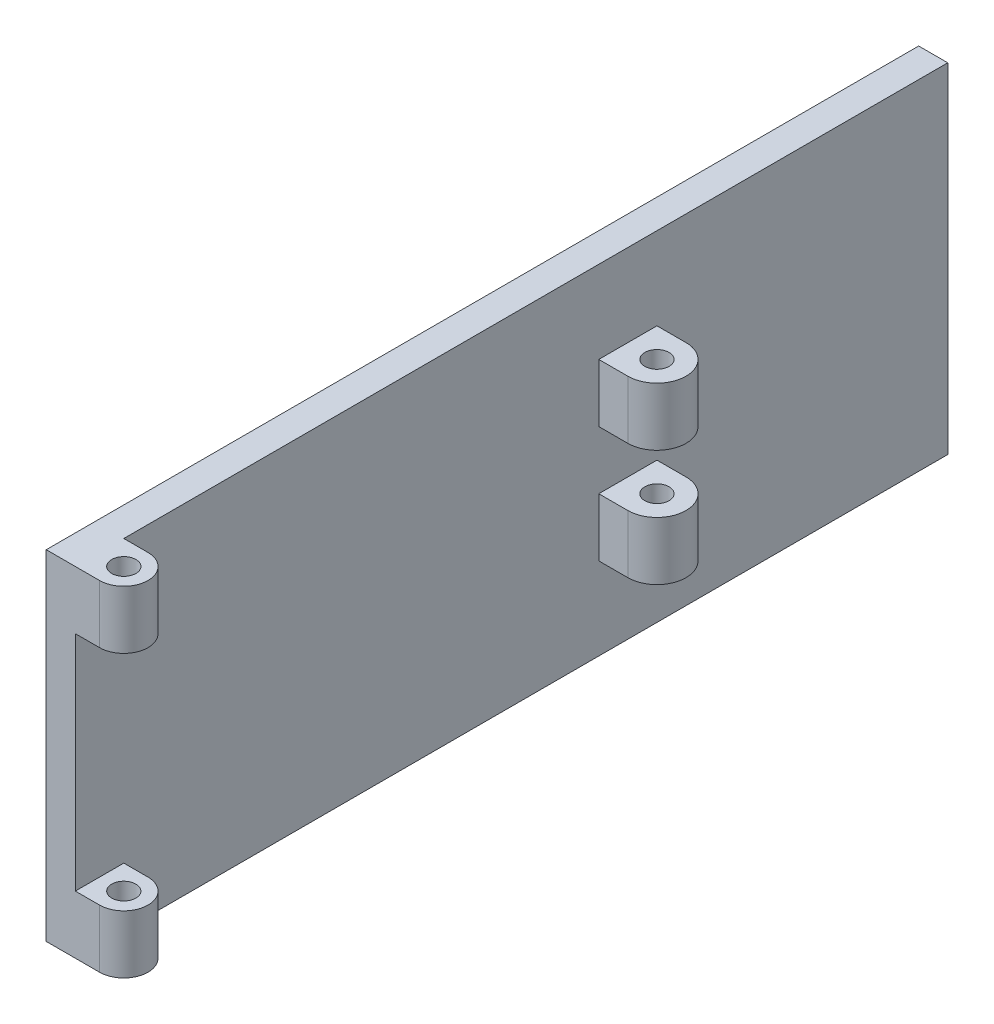
ISO-10303-21;
HEADER;
FILE_DESCRIPTION(('STEP AP214'),'2;1');
FILE_NAME('part.step','',(''),(''),'','','');
FILE_SCHEMA(('AUTOMOTIVE_DESIGN { 1 0 10303 214 1 1 1 1 }'));
ENDSEC;
DATA;
#1=APPLICATION_CONTEXT('core data for automotive mechanical design processes');
#2=APPLICATION_PROTOCOL_DEFINITION('international standard','automotive_design',2000,#1);
#3=PRODUCT_CONTEXT('',#1,'mechanical');
#4=PRODUCT('Part','Part','',(#3));
#5=PRODUCT_RELATED_PRODUCT_CATEGORY('part','',(#4));
#6=PRODUCT_DEFINITION_FORMATION('','',#4);
#7=PRODUCT_DEFINITION_CONTEXT('part definition',#1,'design');
#8=PRODUCT_DEFINITION('design','',#6,#7);
#9=PRODUCT_DEFINITION_SHAPE('','',#8);
#10=(LENGTH_UNIT() NAMED_UNIT(*) SI_UNIT(.MILLI.,.METRE.));
#11=(NAMED_UNIT(*) PLANE_ANGLE_UNIT() SI_UNIT($,.RADIAN.));
#12=(NAMED_UNIT(*) SI_UNIT($,.STERADIAN.) SOLID_ANGLE_UNIT());
#13=UNCERTAINTY_MEASURE_WITH_UNIT(LENGTH_MEASURE(1.E-05),#10,'distance_accuracy_value','');
#14=(GEOMETRIC_REPRESENTATION_CONTEXT(3) GLOBAL_UNCERTAINTY_ASSIGNED_CONTEXT((#13)) GLOBAL_UNIT_ASSIGNED_CONTEXT((#10,
#11,#12)) REPRESENTATION_CONTEXT('',''));
#15=CARTESIAN_POINT('',(0.,0.,0.));
#16=DIRECTION('',(0.,0.,1.));
#17=DIRECTION('',(1.,0.,0.));
#18=AXIS2_PLACEMENT_3D('',#15,#16,#17);
#19=CARTESIAN_POINT('',(9.,20.5,-54.));
#20=DIRECTION('',(0.,1.,0.));
#21=DIRECTION('',(0.,0.,1.));
#22=AXIS2_PLACEMENT_3D('',#19,#20,#21);
#23=PLANE('',#22);
#24=CARTESIAN_POINT('',(6.,20.5,-57.));
#25=DIRECTION('',(0.,1.,0.));
#26=DIRECTION('',(0.,0.,1.));
#27=AXIS2_PLACEMENT_3D('',#24,#25,#26);
#28=CIRCLE('',#27,1.25);
#29=CARTESIAN_POINT('',(6.,20.5,-55.75));
#30=VERTEX_POINT('',#29);
#31=EDGE_CURVE('E487',#30,#30,#28,.T.);
#32=ORIENTED_EDGE('',*,*,#31,.T.);
#33=EDGE_LOOP('',(#32));
#34=FACE_BOUND('',#33,.T.);
#35=CARTESIAN_POINT('',(6.,20.5,-57.));
#36=DIRECTION('',(0.,1.,0.));
#37=DIRECTION('',(0.,0.,1.));
#38=AXIS2_PLACEMENT_3D('',#35,#36,#37);
#39=CIRCLE('',#38,3.);
#40=CARTESIAN_POINT('',(6.,20.5,-54.));
#41=VERTEX_POINT('',#40);
#42=CARTESIAN_POINT('',(6.,20.5,-60.));
#43=VERTEX_POINT('',#42);
#44=EDGE_CURVE('E246',#41,#43,#39,.T.);
#45=ORIENTED_EDGE('',*,*,#44,.F.);
#46=DIRECTION('',(-1.,0.,0.));
#47=VECTOR('',#46,1.);
#48=CARTESIAN_POINT('',(9.,20.5,-54.));
#49=LINE('',#48,#47);
#50=CARTESIAN_POINT('',(3.,20.5,-54.));
#51=VERTEX_POINT('',#50);
#52=EDGE_CURVE('E254',#41,#51,#49,.T.);
#53=ORIENTED_EDGE('',*,*,#52,.T.);
#54=DIRECTION('',(0.,0.,-1.));
#55=VECTOR('',#54,1.);
#56=CARTESIAN_POINT('',(3.,20.5,-54.));
#57=LINE('',#56,#55);
#58=CARTESIAN_POINT('',(3.,20.5,-60.));
#59=VERTEX_POINT('',#58);
#60=EDGE_CURVE('E471',#51,#59,#57,.T.);
#61=ORIENTED_EDGE('',*,*,#60,.T.);
#62=DIRECTION('',(-1.,0.,0.));
#63=VECTOR('',#62,1.);
#64=CARTESIAN_POINT('',(9.,20.5,-60.));
#65=LINE('',#64,#63);
#66=EDGE_CURVE('E264',#43,#59,#65,.T.);
#67=ORIENTED_EDGE('',*,*,#66,.F.);
#68=EDGE_LOOP('',(#45,#53,#61,#67));
#69=FACE_BOUND('',#68,.T.);
#70=ADVANCED_FACE('F107',(#34,#69),#23,.F.);
#71=CARTESIAN_POINT('',(9.,26.5,-54.));
#72=DIRECTION('',(0.,-1.,0.));
#73=DIRECTION('',(0.,0.,-1.));
#74=AXIS2_PLACEMENT_3D('',#71,#72,#73);
#75=PLANE('',#74);
#76=CARTESIAN_POINT('',(6.,26.5,-57.));
#77=DIRECTION('',(0.,-1.,0.));
#78=DIRECTION('',(0.,0.,-1.));
#79=AXIS2_PLACEMENT_3D('',#76,#77,#78);
#80=CIRCLE('',#79,1.25);
#81=CARTESIAN_POINT('',(6.,26.5,-58.25));
#82=VERTEX_POINT('',#81);
#83=EDGE_CURVE('E484',#82,#82,#80,.T.);
#84=ORIENTED_EDGE('',*,*,#83,.T.);
#85=EDGE_LOOP('',(#84));
#86=FACE_BOUND('',#85,.T.);
#87=DIRECTION('',(-1.,0.,0.));
#88=VECTOR('',#87,1.);
#89=CARTESIAN_POINT('',(9.,26.5,-54.));
#90=LINE('',#89,#88);
#91=CARTESIAN_POINT('',(6.,26.5,-54.));
#92=VERTEX_POINT('',#91);
#93=CARTESIAN_POINT('',(3.,26.5,-54.));
#94=VERTEX_POINT('',#93);
#95=EDGE_CURVE('E252',#92,#94,#90,.T.);
#96=ORIENTED_EDGE('',*,*,#95,.F.);
#97=CARTESIAN_POINT('',(6.,26.5,-57.));
#98=DIRECTION('',(0.,-1.,0.));
#99=DIRECTION('',(0.,0.,-1.));
#100=AXIS2_PLACEMENT_3D('',#97,#98,#99);
#101=CIRCLE('',#100,3.);
#102=CARTESIAN_POINT('',(6.,26.5,-60.));
#103=VERTEX_POINT('',#102);
#104=EDGE_CURVE('E236',#103,#92,#101,.T.);
#105=ORIENTED_EDGE('',*,*,#104,.F.);
#106=DIRECTION('',(-1.,0.,0.));
#107=VECTOR('',#106,1.);
#108=CARTESIAN_POINT('',(9.,26.5,-60.));
#109=LINE('',#108,#107);
#110=CARTESIAN_POINT('',(3.,26.5,-60.));
#111=VERTEX_POINT('',#110);
#112=EDGE_CURVE('E262',#103,#111,#109,.T.);
#113=ORIENTED_EDGE('',*,*,#112,.T.);
#114=DIRECTION('',(0.,0.,1.));
#115=VECTOR('',#114,1.);
#116=CARTESIAN_POINT('',(3.,26.5,-54.));
#117=LINE('',#116,#115);
#118=EDGE_CURVE('E261',#111,#94,#117,.T.);
#119=ORIENTED_EDGE('',*,*,#118,.T.);
#120=EDGE_LOOP('',(#96,#105,#113,#119));
#121=FACE_BOUND('',#120,.T.);
#122=ADVANCED_FACE('F259',(#86,#121),#75,.F.);
#123=CARTESIAN_POINT('',(9.,8.49999999999999,-54.));
#124=DIRECTION('',(0.,1.,0.));
#125=DIRECTION('',(0.,0.,1.));
#126=AXIS2_PLACEMENT_3D('',#123,#124,#125);
#127=PLANE('',#126);
#128=CARTESIAN_POINT('',(6.,8.49999999999999,-57.));
#129=DIRECTION('',(0.,1.,0.));
#130=DIRECTION('',(0.,0.,1.));
#131=AXIS2_PLACEMENT_3D('',#128,#129,#130);
#132=CIRCLE('',#131,1.25);
#133=CARTESIAN_POINT('',(6.,8.49999999999999,-55.75));
#134=VERTEX_POINT('',#133);
#135=EDGE_CURVE('E479',#134,#134,#132,.T.);
#136=ORIENTED_EDGE('',*,*,#135,.T.);
#137=EDGE_LOOP('',(#136));
#138=FACE_BOUND('',#137,.T.);
#139=CARTESIAN_POINT('',(6.,8.49999999999999,-57.));
#140=DIRECTION('',(0.,1.,0.));
#141=DIRECTION('',(0.,0.,1.));
#142=AXIS2_PLACEMENT_3D('',#139,#140,#141);
#143=CIRCLE('',#142,3.);
#144=CARTESIAN_POINT('',(6.,8.49999999999999,-54.));
#145=VERTEX_POINT('',#144);
#146=CARTESIAN_POINT('',(6.,8.49999999999999,-60.));
#147=VERTEX_POINT('',#146);
#148=EDGE_CURVE('E247',#145,#147,#143,.T.);
#149=ORIENTED_EDGE('',*,*,#148,.F.);
#150=DIRECTION('',(-1.,0.,0.));
#151=VECTOR('',#150,1.);
#152=CARTESIAN_POINT('',(9.,8.49999999999999,-54.));
#153=LINE('',#152,#151);
#154=CARTESIAN_POINT('',(3.,8.49999999999999,-54.));
#155=VERTEX_POINT('',#154);
#156=EDGE_CURVE('E124',#145,#155,#153,.T.);
#157=ORIENTED_EDGE('',*,*,#156,.T.);
#158=DIRECTION('',(0.,0.,-1.));
#159=VECTOR('',#158,1.);
#160=CARTESIAN_POINT('',(3.,8.49999999999999,-54.));
#161=LINE('',#160,#159);
#162=CARTESIAN_POINT('',(3.,8.49999999999999,-60.));
#163=VERTEX_POINT('',#162);
#164=EDGE_CURVE('E492',#155,#163,#161,.T.);
#165=ORIENTED_EDGE('',*,*,#164,.T.);
#166=DIRECTION('',(-1.,0.,0.));
#167=VECTOR('',#166,1.);
#168=CARTESIAN_POINT('',(9.,8.49999999999999,-60.));
#169=LINE('',#168,#167);
#170=EDGE_CURVE('E132',#147,#163,#169,.T.);
#171=ORIENTED_EDGE('',*,*,#170,.F.);
#172=EDGE_LOOP('',(#149,#157,#165,#171));
#173=FACE_BOUND('',#172,.T.);
#174=ADVANCED_FACE('F377',(#138,#173),#127,.F.);
#175=CARTESIAN_POINT('',(9.,14.5,-54.));
#176=DIRECTION('',(0.,-1.,0.));
#177=DIRECTION('',(0.,0.,-1.));
#178=AXIS2_PLACEMENT_3D('',#175,#176,#177);
#179=PLANE('',#178);
#180=CARTESIAN_POINT('',(6.,14.5,-57.));
#181=DIRECTION('',(0.,-1.,0.));
#182=DIRECTION('',(0.,0.,-1.));
#183=AXIS2_PLACEMENT_3D('',#180,#181,#182);
#184=CIRCLE('',#183,1.25);
#185=CARTESIAN_POINT('',(6.,14.5,-58.25));
#186=VERTEX_POINT('',#185);
#187=EDGE_CURVE('E111',#186,#186,#184,.T.);
#188=ORIENTED_EDGE('',*,*,#187,.T.);
#189=EDGE_LOOP('',(#188));
#190=FACE_BOUND('',#189,.T.);
#191=DIRECTION('',(-1.,0.,0.));
#192=VECTOR('',#191,1.);
#193=CARTESIAN_POINT('',(9.,14.5,-54.));
#194=LINE('',#193,#192);
#195=CARTESIAN_POINT('',(6.,14.5,-54.));
#196=VERTEX_POINT('',#195);
#197=CARTESIAN_POINT('',(3.,14.5,-54.));
#198=VERTEX_POINT('',#197);
#199=EDGE_CURVE('E499',#196,#198,#194,.T.);
#200=ORIENTED_EDGE('',*,*,#199,.F.);
#201=CARTESIAN_POINT('',(6.,14.5,-57.));
#202=DIRECTION('',(0.,-1.,0.));
#203=DIRECTION('',(0.,0.,-1.));
#204=AXIS2_PLACEMENT_3D('',#201,#202,#203);
#205=CIRCLE('',#204,3.);
#206=CARTESIAN_POINT('',(6.,14.5,-60.));
#207=VERTEX_POINT('',#206);
#208=EDGE_CURVE('E507',#207,#196,#205,.T.);
#209=ORIENTED_EDGE('',*,*,#208,.F.);
#210=DIRECTION('',(-1.,0.,0.));
#211=VECTOR('',#210,1.);
#212=CARTESIAN_POINT('',(9.,14.5,-60.));
#213=LINE('',#212,#211);
#214=CARTESIAN_POINT('',(3.,14.5,-60.));
#215=VERTEX_POINT('',#214);
#216=EDGE_CURVE('E501',#207,#215,#213,.T.);
#217=ORIENTED_EDGE('',*,*,#216,.T.);
#218=DIRECTION('',(0.,0.,1.));
#219=VECTOR('',#218,1.);
#220=CARTESIAN_POINT('',(3.,14.5,-54.));
#221=LINE('',#220,#219);
#222=EDGE_CURVE('E496',#215,#198,#221,.T.);
#223=ORIENTED_EDGE('',*,*,#222,.T.);
#224=EDGE_LOOP('',(#200,#209,#217,#223));
#225=FACE_BOUND('',#224,.T.);
#226=ADVANCED_FACE('F387',(#190,#225),#179,.F.);
#227=CARTESIAN_POINT('',(9.,26.5,-54.));
#228=DIRECTION('',(0.,0.,-1.));
#229=DIRECTION('',(-1.,0.,0.));
#230=AXIS2_PLACEMENT_3D('',#227,#228,#229);
#231=PLANE('',#230);
#232=DIRECTION('',(0.,-1.,0.));
#233=VECTOR('',#232,1.);
#234=CARTESIAN_POINT('',(6.,35.,-54.));
#235=LINE('',#234,#233);
#236=EDGE_CURVE('E239',#92,#41,#235,.T.);
#237=ORIENTED_EDGE('',*,*,#236,.F.);
#238=ORIENTED_EDGE('',*,*,#95,.T.);
#239=DIRECTION('',(0.,-1.,0.));
#240=VECTOR('',#239,1.);
#241=CARTESIAN_POINT('',(3.,26.5,-54.));
#242=LINE('',#241,#240);
#243=EDGE_CURVE('E467',#94,#51,#242,.T.);
#244=ORIENTED_EDGE('',*,*,#243,.T.);
#245=ORIENTED_EDGE('',*,*,#52,.F.);
#246=EDGE_LOOP('',(#237,#238,#244,#245));
#247=FACE_BOUND('',#246,.T.);
#248=ADVANCED_FACE('F250',(#247),#231,.F.);
#249=CARTESIAN_POINT('',(9.,14.5,-54.));
#250=DIRECTION('',(0.,0.,-1.));
#251=DIRECTION('',(-1.,0.,0.));
#252=AXIS2_PLACEMENT_3D('',#249,#250,#251);
#253=PLANE('',#252);
#254=EDGE_CURVE('E256',#196,#145,#235,.T.);
#255=ORIENTED_EDGE('',*,*,#254,.F.);
#256=ORIENTED_EDGE('',*,*,#199,.T.);
#257=DIRECTION('',(0.,-1.,0.));
#258=VECTOR('',#257,1.);
#259=CARTESIAN_POINT('',(3.,14.5,-54.));
#260=LINE('',#259,#258);
#261=EDGE_CURVE('E489',#198,#155,#260,.T.);
#262=ORIENTED_EDGE('',*,*,#261,.T.);
#263=ORIENTED_EDGE('',*,*,#156,.F.);
#264=EDGE_LOOP('',(#255,#256,#262,#263));
#265=FACE_BOUND('',#264,.T.);
#266=ADVANCED_FACE('F386',(#265),#253,.F.);
#267=CARTESIAN_POINT('',(3.,0.,0.));
#268=DIRECTION('',(-1.,0.,0.));
#269=DIRECTION('',(0.,0.,1.));
#270=AXIS2_PLACEMENT_3D('',#267,#268,#269);
#271=PLANE('',#270);
#272=ORIENTED_EDGE('',*,*,#243,.F.);
#273=ORIENTED_EDGE('',*,*,#118,.F.);
#274=DIRECTION('',(0.,1.,0.));
#275=VECTOR('',#274,1.);
#276=CARTESIAN_POINT('',(3.,26.5,-60.));
#277=LINE('',#276,#275);
#278=EDGE_CURVE('E266',#59,#111,#277,.T.);
#279=ORIENTED_EDGE('',*,*,#278,.F.);
#280=ORIENTED_EDGE('',*,*,#60,.F.);
#281=EDGE_LOOP('',(#272,#273,#279,#280));
#282=FACE_BOUND('',#281,.T.);
#283=DIRECTION('',(0.,1.,0.));
#284=VECTOR('',#283,1.);
#285=CARTESIAN_POINT('',(3.,0.,-5.));
#286=LINE('',#285,#284);
#287=CARTESIAN_POINT('',(3.,0.,-5.));
#288=VERTEX_POINT('',#287);
#289=CARTESIAN_POINT('',(3.,6.,-5.));
#290=VERTEX_POINT('',#289);
#291=EDGE_CURVE('E298',#288,#290,#286,.T.);
#292=ORIENTED_EDGE('',*,*,#291,.F.);
#293=DIRECTION('',(0.,0.,-1.));
#294=VECTOR('',#293,1.);
#295=CARTESIAN_POINT('',(3.,0.,0.));
#296=LINE('',#295,#294);
#297=CARTESIAN_POINT('',(3.,0.,-90.));
#298=VERTEX_POINT('',#297);
#299=EDGE_CURVE('E326',#288,#298,#296,.T.);
#300=ORIENTED_EDGE('',*,*,#299,.T.);
#301=DIRECTION('',(0.,1.,0.));
#302=VECTOR('',#301,1.);
#303=CARTESIAN_POINT('',(3.,0.,-90.));
#304=LINE('',#303,#302);
#305=CARTESIAN_POINT('',(3.,35.,-90.));
#306=VERTEX_POINT('',#305);
#307=EDGE_CURVE('E329',#298,#306,#304,.T.);
#308=ORIENTED_EDGE('',*,*,#307,.T.);
#309=DIRECTION('',(0.,0.,1.));
#310=VECTOR('',#309,1.);
#311=CARTESIAN_POINT('',(3.,35.,0.));
#312=LINE('',#311,#310);
#313=CARTESIAN_POINT('',(3.,35.,-5.));
#314=VERTEX_POINT('',#313);
#315=EDGE_CURVE('E331',#306,#314,#312,.T.);
#316=ORIENTED_EDGE('',*,*,#315,.T.);
#317=DIRECTION('',(0.,1.,0.));
#318=VECTOR('',#317,1.);
#319=CARTESIAN_POINT('',(3.,35.,-5.));
#320=LINE('',#319,#318);
#321=CARTESIAN_POINT('',(3.,29.,-5.));
#322=VERTEX_POINT('',#321);
#323=EDGE_CURVE('E313',#322,#314,#320,.T.);
#324=ORIENTED_EDGE('',*,*,#323,.F.);
#325=DIRECTION('',(0.,0.,-1.));
#326=VECTOR('',#325,1.);
#327=CARTESIAN_POINT('',(3.,29.,0.));
#328=LINE('',#327,#326);
#329=CARTESIAN_POINT('',(3.,29.,0.));
#330=VERTEX_POINT('',#329);
#331=EDGE_CURVE('E310',#330,#322,#328,.T.);
#332=ORIENTED_EDGE('',*,*,#331,.F.);
#333=DIRECTION('',(0.,-1.,0.));
#334=VECTOR('',#333,1.);
#335=CARTESIAN_POINT('',(3.,0.,0.));
#336=LINE('',#335,#334);
#337=CARTESIAN_POINT('',(3.,6.,0.));
#338=VERTEX_POINT('',#337);
#339=EDGE_CURVE('E323',#330,#338,#336,.T.);
#340=ORIENTED_EDGE('',*,*,#339,.T.);
#341=DIRECTION('',(0.,0.,1.));
#342=VECTOR('',#341,1.);
#343=CARTESIAN_POINT('',(3.,6.,0.));
#344=LINE('',#343,#342);
#345=EDGE_CURVE('E301',#290,#338,#344,.T.);
#346=ORIENTED_EDGE('',*,*,#345,.F.);
#347=EDGE_LOOP('',(#292,#300,#308,#316,#324,#332,#340,#346));
#348=FACE_BOUND('',#347,.T.);
#349=ORIENTED_EDGE('',*,*,#261,.F.);
#350=ORIENTED_EDGE('',*,*,#222,.F.);
#351=DIRECTION('',(0.,1.,0.));
#352=VECTOR('',#351,1.);
#353=CARTESIAN_POINT('',(3.,14.5,-60.));
#354=LINE('',#353,#352);
#355=EDGE_CURVE('E494',#163,#215,#354,.T.);
#356=ORIENTED_EDGE('',*,*,#355,.F.);
#357=ORIENTED_EDGE('',*,*,#164,.F.);
#358=EDGE_LOOP('',(#349,#350,#356,#357));
#359=FACE_BOUND('',#358,.T.);
#360=ADVANCED_FACE('F411',(#282,#348,#359),#271,.F.);
#361=CARTESIAN_POINT('',(3.,0.,0.));
#362=DIRECTION('',(0.,1.,0.));
#363=DIRECTION('',(0.,0.,1.));
#364=AXIS2_PLACEMENT_3D('',#361,#362,#363);
#365=PLANE('',#364);
#366=CARTESIAN_POINT('',(5.5,0.,-2.5));
#367=DIRECTION('',(0.,-1.,0.));
#368=DIRECTION('',(0.,0.,-1.));
#369=AXIS2_PLACEMENT_3D('',#366,#367,#368);
#370=CIRCLE('',#369,1.25);
#371=CARTESIAN_POINT('',(5.5,0.,-3.75));
#372=VERTEX_POINT('',#371);
#373=EDGE_CURVE('E288',#372,#372,#370,.T.);
#374=ORIENTED_EDGE('',*,*,#373,.F.);
#375=EDGE_LOOP('',(#374));
#376=FACE_BOUND('',#375,.T.);
#377=CARTESIAN_POINT('',(5.5,0.,-2.5));
#378=DIRECTION('',(0.,-1.,0.));
#379=DIRECTION('',(0.,0.,-1.));
#380=AXIS2_PLACEMENT_3D('',#377,#378,#379);
#381=CIRCLE('',#380,2.5);
#382=CARTESIAN_POINT('',(5.5,0.,-5.));
#383=VERTEX_POINT('',#382);
#384=CARTESIAN_POINT('',(5.5,0.,0.));
#385=VERTEX_POINT('',#384);
#386=EDGE_CURVE('E276',#383,#385,#381,.T.);
#387=ORIENTED_EDGE('',*,*,#386,.T.);
#388=DIRECTION('',(-1.,0.,0.));
#389=VECTOR('',#388,1.);
#390=CARTESIAN_POINT('',(3.,0.,0.));
#391=LINE('',#390,#389);
#392=CARTESIAN_POINT('',(0.,0.,0.));
#393=VERTEX_POINT('',#392);
#394=EDGE_CURVE('E12',#385,#393,#391,.T.);
#395=ORIENTED_EDGE('',*,*,#394,.T.);
#396=DIRECTION('',(0.,0.,-1.));
#397=VECTOR('',#396,1.);
#398=CARTESIAN_POINT('',(0.,0.,0.));
#399=LINE('',#398,#397);
#400=CARTESIAN_POINT('',(0.,0.,-90.));
#401=VERTEX_POINT('',#400);
#402=EDGE_CURVE('E337',#393,#401,#399,.T.);
#403=ORIENTED_EDGE('',*,*,#402,.T.);
#404=DIRECTION('',(-1.,0.,0.));
#405=VECTOR('',#404,1.);
#406=CARTESIAN_POINT('',(3.,0.,-90.));
#407=LINE('',#406,#405);
#408=EDGE_CURVE('E116',#298,#401,#407,.T.);
#409=ORIENTED_EDGE('',*,*,#408,.F.);
#410=ORIENTED_EDGE('',*,*,#299,.F.);
#411=DIRECTION('',(-1.,0.,0.));
#412=VECTOR('',#411,1.);
#413=CARTESIAN_POINT('',(8.,0.,-5.));
#414=LINE('',#413,#412);
#415=EDGE_CURVE('E308',#383,#288,#414,.T.);
#416=ORIENTED_EDGE('',*,*,#415,.F.);
#417=EDGE_LOOP('',(#387,#395,#403,#409,#410,#416));
#418=FACE_BOUND('',#417,.T.);
#419=ADVANCED_FACE('F426',(#376,#418),#365,.F.);
#420=CARTESIAN_POINT('',(3.,35.,0.));
#421=DIRECTION('',(0.,-1.,0.));
#422=DIRECTION('',(0.,0.,-1.));
#423=AXIS2_PLACEMENT_3D('',#420,#421,#422);
#424=PLANE('',#423);
#425=CARTESIAN_POINT('',(5.5,35.,-2.5));
#426=DIRECTION('',(0.,-1.,0.));
#427=DIRECTION('',(0.,0.,-1.));
#428=AXIS2_PLACEMENT_3D('',#425,#426,#427);
#429=CIRCLE('',#428,1.25);
#430=CARTESIAN_POINT('',(5.5,35.,-3.75));
#431=VERTEX_POINT('',#430);
#432=EDGE_CURVE('E289',#431,#431,#429,.T.);
#433=ORIENTED_EDGE('',*,*,#432,.T.);
#434=EDGE_LOOP('',(#433));
#435=FACE_BOUND('',#434,.T.);
#436=DIRECTION('',(-1.,0.,0.));
#437=VECTOR('',#436,1.);
#438=CARTESIAN_POINT('',(3.,35.,0.));
#439=LINE('',#438,#437);
#440=CARTESIAN_POINT('',(5.5,35.,0.));
#441=VERTEX_POINT('',#440);
#442=CARTESIAN_POINT('',(0.,35.,0.));
#443=VERTEX_POINT('',#442);
#444=EDGE_CURVE('E334',#441,#443,#439,.T.);
#445=ORIENTED_EDGE('',*,*,#444,.F.);
#446=CARTESIAN_POINT('',(5.5,35.,-2.5));
#447=DIRECTION('',(0.,-1.,0.));
#448=DIRECTION('',(0.,0.,-1.));
#449=AXIS2_PLACEMENT_3D('',#446,#447,#448);
#450=CIRCLE('',#449,2.5);
#451=CARTESIAN_POINT('',(5.5,35.,-5.));
#452=VERTEX_POINT('',#451);
#453=EDGE_CURVE('E277',#452,#441,#450,.T.);
#454=ORIENTED_EDGE('',*,*,#453,.F.);
#455=DIRECTION('',(-1.,0.,0.));
#456=VECTOR('',#455,1.);
#457=CARTESIAN_POINT('',(8.,35.,-5.));
#458=LINE('',#457,#456);
#459=EDGE_CURVE('E316',#452,#314,#458,.T.);
#460=ORIENTED_EDGE('',*,*,#459,.T.);
#461=ORIENTED_EDGE('',*,*,#315,.F.);
#462=DIRECTION('',(-1.,0.,0.));
#463=VECTOR('',#462,1.);
#464=CARTESIAN_POINT('',(3.,35.,-90.));
#465=LINE('',#464,#463);
#466=CARTESIAN_POINT('',(0.,35.,-90.));
#467=VERTEX_POINT('',#466);
#468=EDGE_CURVE('E344',#306,#467,#465,.T.);
#469=ORIENTED_EDGE('',*,*,#468,.T.);
#470=DIRECTION('',(0.,0.,1.));
#471=VECTOR('',#470,1.);
#472=CARTESIAN_POINT('',(0.,35.,0.));
#473=LINE('',#472,#471);
#474=EDGE_CURVE('E327',#467,#443,#473,.T.);
#475=ORIENTED_EDGE('',*,*,#474,.T.);
#476=EDGE_LOOP('',(#445,#454,#460,#461,#469,#475));
#477=FACE_BOUND('',#476,.T.);
#478=ADVANCED_FACE('F436',(#435,#477),#424,.F.);
#479=CARTESIAN_POINT('',(8.,29.,0.));
#480=DIRECTION('',(0.,1.,0.));
#481=DIRECTION('',(0.,0.,1.));
#482=AXIS2_PLACEMENT_3D('',#479,#480,#481);
#483=PLANE('',#482);
#484=CARTESIAN_POINT('',(5.5,29.,-2.5));
#485=DIRECTION('',(0.,1.,0.));
#486=DIRECTION('',(0.,0.,1.));
#487=AXIS2_PLACEMENT_3D('',#484,#485,#486);
#488=CIRCLE('',#487,1.25);
#489=CARTESIAN_POINT('',(5.5,29.,-1.25));
#490=VERTEX_POINT('',#489);
#491=EDGE_CURVE('E295',#490,#490,#488,.T.);
#492=ORIENTED_EDGE('',*,*,#491,.T.);
#493=EDGE_LOOP('',(#492));
#494=FACE_BOUND('',#493,.T.);
#495=CARTESIAN_POINT('',(5.5,29.,-2.5));
#496=DIRECTION('',(0.,1.,0.));
#497=DIRECTION('',(0.,0.,1.));
#498=AXIS2_PLACEMENT_3D('',#495,#496,#497);
#499=CIRCLE('',#498,2.5);
#500=CARTESIAN_POINT('',(5.5,29.,0.));
#501=VERTEX_POINT('',#500);
#502=CARTESIAN_POINT('',(5.5,29.,-5.));
#503=VERTEX_POINT('',#502);
#504=EDGE_CURVE('E286',#501,#503,#499,.T.);
#505=ORIENTED_EDGE('',*,*,#504,.F.);
#506=DIRECTION('',(-1.,0.,0.));
#507=VECTOR('',#506,1.);
#508=CARTESIAN_POINT('',(8.,29.,0.));
#509=LINE('',#508,#507);
#510=EDGE_CURVE('E320',#501,#330,#509,.T.);
#511=ORIENTED_EDGE('',*,*,#510,.T.);
#512=ORIENTED_EDGE('',*,*,#331,.T.);
#513=DIRECTION('',(-1.,0.,0.));
#514=VECTOR('',#513,1.);
#515=CARTESIAN_POINT('',(8.,29.,-5.));
#516=LINE('',#515,#514);
#517=EDGE_CURVE('E318',#503,#322,#516,.T.);
#518=ORIENTED_EDGE('',*,*,#517,.F.);
#519=EDGE_LOOP('',(#505,#511,#512,#518));
#520=FACE_BOUND('',#519,.T.);
#521=ADVANCED_FACE('F406',(#494,#520),#483,.F.);
#522=CARTESIAN_POINT('',(8.,6.,0.));
#523=DIRECTION('',(0.,-1.,0.));
#524=DIRECTION('',(0.,0.,-1.));
#525=AXIS2_PLACEMENT_3D('',#522,#523,#524);
#526=PLANE('',#525);
#527=CARTESIAN_POINT('',(5.5,6.,-2.5));
#528=DIRECTION('',(0.,-1.,0.));
#529=DIRECTION('',(0.,0.,-1.));
#530=AXIS2_PLACEMENT_3D('',#527,#528,#529);
#531=CIRCLE('',#530,1.25);
#532=CARTESIAN_POINT('',(5.5,6.,-3.75));
#533=VERTEX_POINT('',#532);
#534=EDGE_CURVE('E292',#533,#533,#531,.T.);
#535=ORIENTED_EDGE('',*,*,#534,.T.);
#536=EDGE_LOOP('',(#535));
#537=FACE_BOUND('',#536,.T.);
#538=DIRECTION('',(-1.,0.,0.));
#539=VECTOR('',#538,1.);
#540=CARTESIAN_POINT('',(8.,6.,0.));
#541=LINE('',#540,#539);
#542=CARTESIAN_POINT('',(5.5,6.,0.));
#543=VERTEX_POINT('',#542);
#544=EDGE_CURVE('E304',#543,#338,#541,.T.);
#545=ORIENTED_EDGE('',*,*,#544,.F.);
#546=CARTESIAN_POINT('',(5.5,6.,-2.5));
#547=DIRECTION('',(0.,-1.,0.));
#548=DIRECTION('',(0.,0.,-1.));
#549=AXIS2_PLACEMENT_3D('',#546,#547,#548);
#550=CIRCLE('',#549,2.5);
#551=CARTESIAN_POINT('',(5.5,6.,-5.));
#552=VERTEX_POINT('',#551);
#553=EDGE_CURVE('E284',#552,#543,#550,.T.);
#554=ORIENTED_EDGE('',*,*,#553,.F.);
#555=DIRECTION('',(-1.,0.,0.));
#556=VECTOR('',#555,1.);
#557=CARTESIAN_POINT('',(8.,6.,-5.));
#558=LINE('',#557,#556);
#559=EDGE_CURVE('E306',#552,#290,#558,.T.);
#560=ORIENTED_EDGE('',*,*,#559,.T.);
#561=ORIENTED_EDGE('',*,*,#345,.T.);
#562=EDGE_LOOP('',(#545,#554,#560,#561));
#563=FACE_BOUND('',#562,.T.);
#564=ADVANCED_FACE('F351',(#537,#563),#526,.F.);
#565=CARTESIAN_POINT('',(3.,0.,0.));
#566=DIRECTION('',(0.,0.,-1.));
#567=DIRECTION('',(-1.,0.,0.));
#568=AXIS2_PLACEMENT_3D('',#565,#566,#567);
#569=PLANE('',#568);
#570=DIRECTION('',(0.,-1.,0.));
#571=VECTOR('',#570,1.);
#572=CARTESIAN_POINT('',(5.5,35.,0.));
#573=LINE('',#572,#571);
#574=EDGE_CURVE('E273',#441,#501,#573,.T.);
#575=ORIENTED_EDGE('',*,*,#574,.F.);
#576=ORIENTED_EDGE('',*,*,#444,.T.);
#577=DIRECTION('',(0.,-1.,0.));
#578=VECTOR('',#577,1.);
#579=CARTESIAN_POINT('',(0.,0.,0.));
#580=LINE('',#579,#578);
#581=EDGE_CURVE('E322',#443,#393,#580,.T.);
#582=ORIENTED_EDGE('',*,*,#581,.T.);
#583=ORIENTED_EDGE('',*,*,#394,.F.);
#584=EDGE_CURVE('E272',#543,#385,#573,.T.);
#585=ORIENTED_EDGE('',*,*,#584,.F.);
#586=ORIENTED_EDGE('',*,*,#544,.T.);
#587=ORIENTED_EDGE('',*,*,#339,.F.);
#588=ORIENTED_EDGE('',*,*,#510,.F.);
#589=EDGE_LOOP('',(#575,#576,#582,#583,#585,#586,#587,#588));
#590=FACE_BOUND('',#589,.T.);
#591=ADVANCED_FACE('F109',(#590),#569,.F.);
#592=CARTESIAN_POINT('',(3.,0.,-90.));
#593=DIRECTION('',(0.,0.,1.));
#594=DIRECTION('',(1.,0.,0.));
#595=AXIS2_PLACEMENT_3D('',#592,#593,#594);
#596=PLANE('',#595);
#597=DIRECTION('',(0.,1.,0.));
#598=VECTOR('',#597,1.);
#599=CARTESIAN_POINT('',(0.,0.,-90.));
#600=LINE('',#599,#598);
#601=EDGE_CURVE('E339',#401,#467,#600,.T.);
#602=ORIENTED_EDGE('',*,*,#601,.T.);
#603=ORIENTED_EDGE('',*,*,#468,.F.);
#604=ORIENTED_EDGE('',*,*,#307,.F.);
#605=ORIENTED_EDGE('',*,*,#408,.T.);
#606=EDGE_LOOP('',(#602,#603,#604,#605));
#607=FACE_BOUND('',#606,.T.);
#608=ADVANCED_FACE('F431',(#607),#596,.F.);
#609=CARTESIAN_POINT('',(0.,0.,0.));
#610=DIRECTION('',(-1.,0.,0.));
#611=DIRECTION('',(0.,0.,1.));
#612=AXIS2_PLACEMENT_3D('',#609,#610,#611);
#613=PLANE('',#612);
#614=ORIENTED_EDGE('',*,*,#581,.F.);
#615=ORIENTED_EDGE('',*,*,#474,.F.);
#616=ORIENTED_EDGE('',*,*,#601,.F.);
#617=ORIENTED_EDGE('',*,*,#402,.F.);
#618=EDGE_LOOP('',(#614,#615,#616,#617));
#619=FACE_BOUND('',#618,.T.);
#620=ADVANCED_FACE('F440',(#619),#613,.T.);
#621=CARTESIAN_POINT('',(8.,35.,-5.));
#622=DIRECTION('',(0.,0.,1.));
#623=DIRECTION('',(0.,-1.,0.));
#624=AXIS2_PLACEMENT_3D('',#621,#622,#623);
#625=PLANE('',#624);
#626=ORIENTED_EDGE('',*,*,#459,.F.);
#627=DIRECTION('',(0.,-1.,0.));
#628=VECTOR('',#627,1.);
#629=CARTESIAN_POINT('',(5.5,35.,-5.));
#630=LINE('',#629,#628);
#631=EDGE_CURVE('E281',#452,#503,#630,.T.);
#632=ORIENTED_EDGE('',*,*,#631,.T.);
#633=ORIENTED_EDGE('',*,*,#517,.T.);
#634=ORIENTED_EDGE('',*,*,#323,.T.);
#635=EDGE_LOOP('',(#626,#632,#633,#634));
#636=FACE_BOUND('',#635,.T.);
#637=ADVANCED_FACE('F366',(#636),#625,.F.);
#638=CARTESIAN_POINT('',(8.,0.,-5.));
#639=DIRECTION('',(0.,0.,1.));
#640=DIRECTION('',(0.,-1.,0.));
#641=AXIS2_PLACEMENT_3D('',#638,#639,#640);
#642=PLANE('',#641);
#643=ORIENTED_EDGE('',*,*,#559,.F.);
#644=EDGE_CURVE('E279',#552,#383,#630,.T.);
#645=ORIENTED_EDGE('',*,*,#644,.T.);
#646=ORIENTED_EDGE('',*,*,#415,.T.);
#647=ORIENTED_EDGE('',*,*,#291,.T.);
#648=EDGE_LOOP('',(#643,#645,#646,#647));
#649=FACE_BOUND('',#648,.T.);
#650=ADVANCED_FACE('F357',(#649),#642,.F.);
#651=CARTESIAN_POINT('',(5.5,35.,-2.5));
#652=DIRECTION('',(0.,-1.,0.));
#653=DIRECTION('',(0.,0.,-1.));
#654=AXIS2_PLACEMENT_3D('',#651,#652,#653);
#655=CYLINDRICAL_SURFACE('',#654,1.25);
#656=ORIENTED_EDGE('',*,*,#373,.T.);
#657=EDGE_LOOP('',(#656));
#658=FACE_BOUND('',#657,.T.);
#659=ORIENTED_EDGE('',*,*,#534,.F.);
#660=EDGE_LOOP('',(#659));
#661=FACE_BOUND('',#660,.T.);
#662=ADVANCED_FACE('F354',(#658,#661),#655,.F.);
#663=ORIENTED_EDGE('',*,*,#432,.F.);
#664=EDGE_LOOP('',(#663));
#665=FACE_BOUND('',#664,.T.);
#666=ORIENTED_EDGE('',*,*,#491,.F.);
#667=EDGE_LOOP('',(#666));
#668=FACE_BOUND('',#667,.T.);
#669=ADVANCED_FACE('F356',(#665,#668),#655,.F.);
#670=CARTESIAN_POINT('',(5.5,35.,-2.5));
#671=DIRECTION('',(0.,-1.,0.));
#672=DIRECTION('',(0.,0.,-1.));
#673=AXIS2_PLACEMENT_3D('',#670,#671,#672);
#674=CYLINDRICAL_SURFACE('',#673,2.5);
#675=ORIENTED_EDGE('',*,*,#553,.T.);
#676=ORIENTED_EDGE('',*,*,#584,.T.);
#677=ORIENTED_EDGE('',*,*,#386,.F.);
#678=ORIENTED_EDGE('',*,*,#644,.F.);
#679=EDGE_LOOP('',(#675,#676,#677,#678));
#680=FACE_BOUND('',#679,.T.);
#681=ADVANCED_FACE('F364',(#680),#674,.T.);
#682=ORIENTED_EDGE('',*,*,#504,.T.);
#683=ORIENTED_EDGE('',*,*,#631,.F.);
#684=ORIENTED_EDGE('',*,*,#453,.T.);
#685=ORIENTED_EDGE('',*,*,#574,.T.);
#686=EDGE_LOOP('',(#682,#683,#684,#685));
#687=FACE_BOUND('',#686,.T.);
#688=ADVANCED_FACE('F388',(#687),#674,.T.);
#689=CARTESIAN_POINT('',(9.,26.5,-60.));
#690=DIRECTION('',(0.,0.,1.));
#691=DIRECTION('',(1.,0.,0.));
#692=AXIS2_PLACEMENT_3D('',#689,#690,#691);
#693=PLANE('',#692);
#694=ORIENTED_EDGE('',*,*,#112,.F.);
#695=DIRECTION('',(0.,-1.,0.));
#696=VECTOR('',#695,1.);
#697=CARTESIAN_POINT('',(6.,35.,-60.));
#698=LINE('',#697,#696);
#699=EDGE_CURVE('E242',#103,#43,#698,.T.);
#700=ORIENTED_EDGE('',*,*,#699,.T.);
#701=ORIENTED_EDGE('',*,*,#66,.T.);
#702=ORIENTED_EDGE('',*,*,#278,.T.);
#703=EDGE_LOOP('',(#694,#700,#701,#702));
#704=FACE_BOUND('',#703,.T.);
#705=ADVANCED_FACE('F384',(#704),#693,.F.);
#706=CARTESIAN_POINT('',(9.,14.5,-60.));
#707=DIRECTION('',(0.,0.,1.));
#708=DIRECTION('',(1.,0.,0.));
#709=AXIS2_PLACEMENT_3D('',#706,#707,#708);
#710=PLANE('',#709);
#711=ORIENTED_EDGE('',*,*,#216,.F.);
#712=EDGE_CURVE('E255',#207,#147,#698,.T.);
#713=ORIENTED_EDGE('',*,*,#712,.T.);
#714=ORIENTED_EDGE('',*,*,#170,.T.);
#715=ORIENTED_EDGE('',*,*,#355,.T.);
#716=EDGE_LOOP('',(#711,#713,#714,#715));
#717=FACE_BOUND('',#716,.T.);
#718=ADVANCED_FACE('F395',(#717),#710,.F.);
#719=CARTESIAN_POINT('',(6.,35.,-57.));
#720=DIRECTION('',(0.,-1.,0.));
#721=DIRECTION('',(0.,0.,-1.));
#722=AXIS2_PLACEMENT_3D('',#719,#720,#721);
#723=CYLINDRICAL_SURFACE('',#722,1.25);
#724=ORIENTED_EDGE('',*,*,#187,.F.);
#725=EDGE_LOOP('',(#724));
#726=FACE_BOUND('',#725,.T.);
#727=ORIENTED_EDGE('',*,*,#135,.F.);
#728=EDGE_LOOP('',(#727));
#729=FACE_BOUND('',#728,.T.);
#730=ADVANCED_FACE('F510',(#726,#729),#723,.F.);
#731=ORIENTED_EDGE('',*,*,#83,.F.);
#732=EDGE_LOOP('',(#731));
#733=FACE_BOUND('',#732,.T.);
#734=ORIENTED_EDGE('',*,*,#31,.F.);
#735=EDGE_LOOP('',(#734));
#736=FACE_BOUND('',#735,.T.);
#737=ADVANCED_FACE('F515',(#733,#736),#723,.F.);
#738=CARTESIAN_POINT('',(6.,35.,-57.));
#739=DIRECTION('',(0.,-1.,0.));
#740=DIRECTION('',(0.,0.,-1.));
#741=AXIS2_PLACEMENT_3D('',#738,#739,#740);
#742=CYLINDRICAL_SURFACE('',#741,3.);
#743=ORIENTED_EDGE('',*,*,#148,.T.);
#744=ORIENTED_EDGE('',*,*,#712,.F.);
#745=ORIENTED_EDGE('',*,*,#208,.T.);
#746=ORIENTED_EDGE('',*,*,#254,.T.);
#747=EDGE_LOOP('',(#743,#744,#745,#746));
#748=FACE_BOUND('',#747,.T.);
#749=ADVANCED_FACE('F530',(#748),#742,.T.);
#750=ORIENTED_EDGE('',*,*,#44,.T.);
#751=ORIENTED_EDGE('',*,*,#699,.F.);
#752=ORIENTED_EDGE('',*,*,#104,.T.);
#753=ORIENTED_EDGE('',*,*,#236,.T.);
#754=EDGE_LOOP('',(#750,#751,#752,#753));
#755=FACE_BOUND('',#754,.T.);
#756=ADVANCED_FACE('F238',(#755),#742,.T.);
#757=CLOSED_SHELL('',(#70,#122,#174,#226,#248,#266,#360,#419,#478,#521,#564,#591,#608,#620,#637,
#650,#662,#669,#681,#688,#705,#718,#730,#737,#749,#756));
#758=MANIFOLD_SOLID_BREP('B2',#757);
#759=ADVANCED_BREP_SHAPE_REPRESENTATION('',(#18,#758),#14);
#760=SHAPE_DEFINITION_REPRESENTATION(#9,#759);
ENDSEC;
END-ISO-10303-21;
